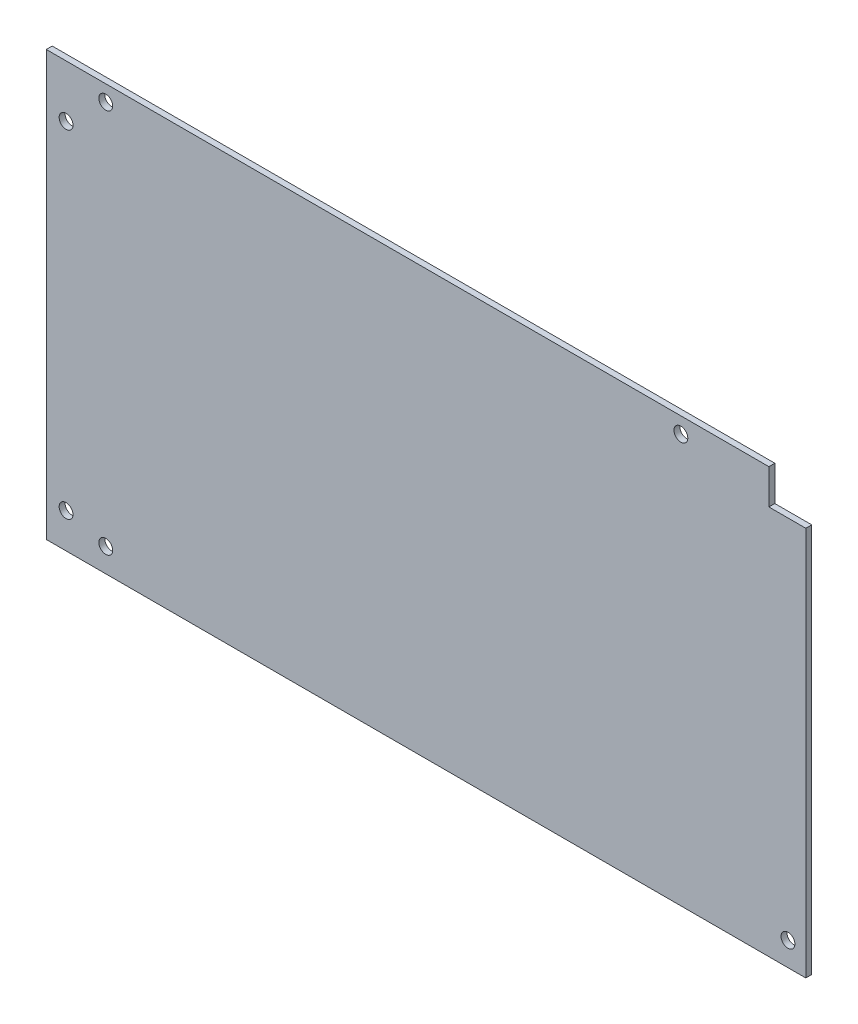
ISO-10303-21;
HEADER;
FILE_DESCRIPTION(('STEP AP214'),'2;1');
FILE_NAME('part.step','',(''),(''),'','','');
FILE_SCHEMA(('AUTOMOTIVE_DESIGN { 1 0 10303 214 1 1 1 1 }'));
ENDSEC;
DATA;
#1=APPLICATION_CONTEXT('core data for automotive mechanical design processes');
#2=APPLICATION_PROTOCOL_DEFINITION('international standard','automotive_design',2000,#1);
#3=PRODUCT_CONTEXT('',#1,'mechanical');
#4=PRODUCT('Part','Part','',(#3));
#5=PRODUCT_RELATED_PRODUCT_CATEGORY('part','',(#4));
#6=PRODUCT_DEFINITION_FORMATION('','',#4);
#7=PRODUCT_DEFINITION_CONTEXT('part definition',#1,'design');
#8=PRODUCT_DEFINITION('design','',#6,#7);
#9=PRODUCT_DEFINITION_SHAPE('','',#8);
#10=(LENGTH_UNIT() NAMED_UNIT(*) SI_UNIT(.MILLI.,.METRE.));
#11=(NAMED_UNIT(*) PLANE_ANGLE_UNIT() SI_UNIT($,.RADIAN.));
#12=(NAMED_UNIT(*) SI_UNIT($,.STERADIAN.) SOLID_ANGLE_UNIT());
#13=UNCERTAINTY_MEASURE_WITH_UNIT(LENGTH_MEASURE(1.E-05),#10,'distance_accuracy_value','');
#14=(GEOMETRIC_REPRESENTATION_CONTEXT(3) GLOBAL_UNCERTAINTY_ASSIGNED_CONTEXT((#13)) GLOBAL_UNIT_ASSIGNED_CONTEXT((#10,
#11,#12)) REPRESENTATION_CONTEXT('',''));
#15=CARTESIAN_POINT('',(0.,0.,0.));
#16=DIRECTION('',(0.,0.,1.));
#17=DIRECTION('',(1.,0.,0.));
#18=AXIS2_PLACEMENT_3D('',#15,#16,#17);
#19=CARTESIAN_POINT('',(-0.137085427136,-0.137085427136,1.5));
#20=DIRECTION('',(0.,0.,-1.));
#21=DIRECTION('',(-1.,0.,0.));
#22=AXIS2_PLACEMENT_3D('',#19,#20,#21);
#23=PLANE('',#22);
#24=CARTESIAN_POINT('',(91.25,-47.5,1.5));
#25=DIRECTION('',(0.,0.,-1.));
#26=DIRECTION('',(-1.,0.,0.));
#27=AXIS2_PLACEMENT_3D('',#24,#25,#26);
#28=CIRCLE('',#27,1.75);
#29=CARTESIAN_POINT('',(89.5,-47.5,1.5));
#30=VERTEX_POINT('',#29);
#31=EDGE_CURVE('E110',#30,#30,#28,.T.);
#32=ORIENTED_EDGE('',*,*,#31,.T.);
#33=EDGE_LOOP('',(#32));
#34=FACE_BOUND('',#33,.T.);
#35=CARTESIAN_POINT('',(-80.75,-47.5,1.5));
#36=DIRECTION('',(0.,0.,-1.));
#37=DIRECTION('',(-1.,0.,0.));
#38=AXIS2_PLACEMENT_3D('',#35,#36,#37);
#39=CIRCLE('',#38,1.75);
#40=CARTESIAN_POINT('',(-82.5,-47.5,1.5));
#41=VERTEX_POINT('',#40);
#42=EDGE_CURVE('E114',#41,#41,#39,.T.);
#43=ORIENTED_EDGE('',*,*,#42,.T.);
#44=EDGE_LOOP('',(#43));
#45=FACE_BOUND('',#44,.T.);
#46=CARTESIAN_POINT('',(-90.75,-44.7,1.5));
#47=DIRECTION('',(0.,0.,-1.));
#48=DIRECTION('',(-1.,0.,0.));
#49=AXIS2_PLACEMENT_3D('',#46,#47,#48);
#50=CIRCLE('',#49,1.75);
#51=CARTESIAN_POINT('',(-92.5,-44.7,1.5));
#52=VERTEX_POINT('',#51);
#53=EDGE_CURVE('E117',#52,#52,#50,.T.);
#54=ORIENTED_EDGE('',*,*,#53,.T.);
#55=EDGE_LOOP('',(#54));
#56=FACE_BOUND('',#55,.T.);
#57=CARTESIAN_POINT('',(-90.75,40.3,1.5));
#58=DIRECTION('',(0.,0.,-1.));
#59=DIRECTION('',(-1.,0.,0.));
#60=AXIS2_PLACEMENT_3D('',#57,#58,#59);
#61=CIRCLE('',#60,1.75);
#62=CARTESIAN_POINT('',(-92.5,40.3,1.5));
#63=VERTEX_POINT('',#62);
#64=EDGE_CURVE('E120',#63,#63,#61,.T.);
#65=ORIENTED_EDGE('',*,*,#64,.T.);
#66=EDGE_LOOP('',(#65));
#67=FACE_BOUND('',#66,.T.);
#68=CARTESIAN_POINT('',(-80.75,49.5,1.5));
#69=DIRECTION('',(0.,0.,-1.));
#70=DIRECTION('',(-1.,0.,0.));
#71=AXIS2_PLACEMENT_3D('',#68,#69,#70);
#72=CIRCLE('',#71,1.75);
#73=CARTESIAN_POINT('',(-82.5,49.5,1.5));
#74=VERTEX_POINT('',#73);
#75=EDGE_CURVE('E122',#74,#74,#72,.T.);
#76=ORIENTED_EDGE('',*,*,#75,.T.);
#77=EDGE_LOOP('',(#76));
#78=FACE_BOUND('',#77,.T.);
#79=CARTESIAN_POINT('',(64.25,49.5,1.5));
#80=DIRECTION('',(0.,0.,-1.));
#81=DIRECTION('',(-1.,0.,0.));
#82=AXIS2_PLACEMENT_3D('',#79,#80,#81);
#83=CIRCLE('',#82,1.75);
#84=CARTESIAN_POINT('',(62.5,49.5,1.5));
#85=VERTEX_POINT('',#84);
#86=EDGE_CURVE('E20',#85,#85,#83,.T.);
#87=ORIENTED_EDGE('',*,*,#86,.T.);
#88=EDGE_LOOP('',(#87));
#89=FACE_BOUND('',#88,.T.);
#90=DIRECTION('',(1.,0.,0.));
#91=VECTOR('',#90,1.);
#92=CARTESIAN_POINT('',(95.75,-53.5,1.5));
#93=LINE('',#92,#91);
#94=CARTESIAN_POINT('',(95.75,-53.5,1.5));
#95=VERTEX_POINT('',#94);
#96=CARTESIAN_POINT('',(-95.75,-53.5,1.5));
#97=VERTEX_POINT('',#96);
#98=EDGE_CURVE('E138',#95,#97,#93,.F.);
#99=ORIENTED_EDGE('',*,*,#98,.F.);
#100=DIRECTION('',(0.,1.,0.));
#101=VECTOR('',#100,1.);
#102=CARTESIAN_POINT('',(95.75,44.7,1.5));
#103=LINE('',#102,#101);
#104=CARTESIAN_POINT('',(95.75,44.7,1.5));
#105=VERTEX_POINT('',#104);
#106=EDGE_CURVE('E143',#105,#95,#103,.F.);
#107=ORIENTED_EDGE('',*,*,#106,.F.);
#108=DIRECTION('',(1.,0.,0.));
#109=VECTOR('',#108,1.);
#110=CARTESIAN_POINT('',(86.45,44.7,1.5));
#111=LINE('',#110,#109);
#112=CARTESIAN_POINT('',(86.45,44.7,1.5));
#113=VERTEX_POINT('',#112);
#114=EDGE_CURVE('E84',#113,#105,#111,.T.);
#115=ORIENTED_EDGE('',*,*,#114,.F.);
#116=DIRECTION('',(0.,1.,0.));
#117=VECTOR('',#116,1.);
#118=CARTESIAN_POINT('',(86.45,53.5,1.5));
#119=LINE('',#118,#117);
#120=CARTESIAN_POINT('',(86.45,53.5,1.5));
#121=VERTEX_POINT('',#120);
#122=EDGE_CURVE('E67',#121,#113,#119,.F.);
#123=ORIENTED_EDGE('',*,*,#122,.F.);
#124=DIRECTION('',(1.,0.,0.));
#125=VECTOR('',#124,1.);
#126=CARTESIAN_POINT('',(-95.75,53.5,1.5));
#127=LINE('',#126,#125);
#128=CARTESIAN_POINT('',(-95.75,53.5,1.5));
#129=VERTEX_POINT('',#128);
#130=EDGE_CURVE('E72',#129,#121,#127,.T.);
#131=ORIENTED_EDGE('',*,*,#130,.F.);
#132=DIRECTION('',(0.,1.,0.));
#133=VECTOR('',#132,1.);
#134=CARTESIAN_POINT('',(-95.75,-53.5,1.5));
#135=LINE('',#134,#133);
#136=EDGE_CURVE('E129',#97,#129,#135,.T.);
#137=ORIENTED_EDGE('',*,*,#136,.F.);
#138=EDGE_LOOP('',(#99,#107,#115,#123,#131,#137));
#139=FACE_BOUND('',#138,.T.);
#140=ADVANCED_FACE('F17',(#34,#45,#56,#67,#78,#89,#139),#23,.F.);
#141=CARTESIAN_POINT('',(-95.75,53.5,0.));
#142=DIRECTION('',(0.,1.,0.));
#143=DIRECTION('',(0.,0.,1.));
#144=AXIS2_PLACEMENT_3D('',#141,#142,#143);
#145=PLANE('',#144);
#146=DIRECTION('',(0.,0.,-1.));
#147=VECTOR('',#146,1.);
#148=CARTESIAN_POINT('',(86.45,53.5,0.));
#149=LINE('',#148,#147);
#150=CARTESIAN_POINT('',(86.45,53.5,0.));
#151=VERTEX_POINT('',#150);
#152=EDGE_CURVE('E74',#151,#121,#149,.F.);
#153=ORIENTED_EDGE('',*,*,#152,.F.);
#154=DIRECTION('',(-1.,0.,0.));
#155=VECTOR('',#154,1.);
#156=CARTESIAN_POINT('',(-0.137085427136,53.5,0.));
#157=LINE('',#156,#155);
#158=CARTESIAN_POINT('',(-95.75,53.5,0.));
#159=VERTEX_POINT('',#158);
#160=EDGE_CURVE('E113',#159,#151,#157,.F.);
#161=ORIENTED_EDGE('',*,*,#160,.F.);
#162=DIRECTION('',(0.,0.,1.));
#163=VECTOR('',#162,1.);
#164=CARTESIAN_POINT('',(-95.75,53.5,0.));
#165=LINE('',#164,#163);
#166=EDGE_CURVE('E77',#129,#159,#165,.F.);
#167=ORIENTED_EDGE('',*,*,#166,.F.);
#168=ORIENTED_EDGE('',*,*,#130,.T.);
#169=EDGE_LOOP('',(#153,#161,#167,#168));
#170=FACE_BOUND('',#169,.T.);
#171=ADVANCED_FACE('F73',(#170),#145,.T.);
#172=CARTESIAN_POINT('',(86.45,53.5,0.));
#173=DIRECTION('',(1.,0.,0.));
#174=DIRECTION('',(0.,0.,-1.));
#175=AXIS2_PLACEMENT_3D('',#172,#173,#174);
#176=PLANE('',#175);
#177=DIRECTION('',(0.,0.,1.));
#178=VECTOR('',#177,1.);
#179=CARTESIAN_POINT('',(86.45,44.7,0.));
#180=LINE('',#179,#178);
#181=CARTESIAN_POINT('',(86.45,44.7,0.));
#182=VERTEX_POINT('',#181);
#183=EDGE_CURVE('E86',#182,#113,#180,.T.);
#184=ORIENTED_EDGE('',*,*,#183,.F.);
#185=DIRECTION('',(0.,1.,0.));
#186=VECTOR('',#185,1.);
#187=CARTESIAN_POINT('',(86.45,-0.137085427136,0.));
#188=LINE('',#187,#186);
#189=EDGE_CURVE('E90',#151,#182,#188,.F.);
#190=ORIENTED_EDGE('',*,*,#189,.F.);
#191=ORIENTED_EDGE('',*,*,#152,.T.);
#192=ORIENTED_EDGE('',*,*,#122,.T.);
#193=EDGE_LOOP('',(#184,#190,#191,#192));
#194=FACE_BOUND('',#193,.T.);
#195=ADVANCED_FACE('F88',(#194),#176,.T.);
#196=CARTESIAN_POINT('',(86.45,44.7,0.));
#197=DIRECTION('',(0.,1.,0.));
#198=DIRECTION('',(0.,0.,1.));
#199=AXIS2_PLACEMENT_3D('',#196,#197,#198);
#200=PLANE('',#199);
#201=DIRECTION('',(0.,0.,-1.));
#202=VECTOR('',#201,1.);
#203=CARTESIAN_POINT('',(95.75,44.7,0.));
#204=LINE('',#203,#202);
#205=CARTESIAN_POINT('',(95.75,44.7,0.));
#206=VERTEX_POINT('',#205);
#207=EDGE_CURVE('E145',#206,#105,#204,.F.);
#208=ORIENTED_EDGE('',*,*,#207,.F.);
#209=DIRECTION('',(-1.,0.,0.));
#210=VECTOR('',#209,1.);
#211=CARTESIAN_POINT('',(-0.137085427136,44.7,0.));
#212=LINE('',#211,#210);
#213=EDGE_CURVE('E152',#182,#206,#212,.F.);
#214=ORIENTED_EDGE('',*,*,#213,.F.);
#215=ORIENTED_EDGE('',*,*,#183,.T.);
#216=ORIENTED_EDGE('',*,*,#114,.T.);
#217=EDGE_LOOP('',(#208,#214,#215,#216));
#218=FACE_BOUND('',#217,.T.);
#219=ADVANCED_FACE('F150',(#218),#200,.T.);
#220=CARTESIAN_POINT('',(95.75,44.7,0.));
#221=DIRECTION('',(1.,0.,0.));
#222=DIRECTION('',(0.,0.,-1.));
#223=AXIS2_PLACEMENT_3D('',#220,#221,#222);
#224=PLANE('',#223);
#225=DIRECTION('',(0.,0.,-1.));
#226=VECTOR('',#225,1.);
#227=CARTESIAN_POINT('',(95.75,-53.5,0.));
#228=LINE('',#227,#226);
#229=CARTESIAN_POINT('',(95.75,-53.5,0.));
#230=VERTEX_POINT('',#229);
#231=EDGE_CURVE('E140',#230,#95,#228,.F.);
#232=ORIENTED_EDGE('',*,*,#231,.F.);
#233=DIRECTION('',(0.,1.,0.));
#234=VECTOR('',#233,1.);
#235=CARTESIAN_POINT('',(95.75,-0.137085427136,0.));
#236=LINE('',#235,#234);
#237=EDGE_CURVE('E156',#206,#230,#236,.F.);
#238=ORIENTED_EDGE('',*,*,#237,.F.);
#239=ORIENTED_EDGE('',*,*,#207,.T.);
#240=ORIENTED_EDGE('',*,*,#106,.T.);
#241=EDGE_LOOP('',(#232,#238,#239,#240));
#242=FACE_BOUND('',#241,.T.);
#243=ADVANCED_FACE('F167',(#242),#224,.T.);
#244=CARTESIAN_POINT('',(95.75,-53.5,0.));
#245=DIRECTION('',(0.,-1.,0.));
#246=DIRECTION('',(0.,0.,-1.));
#247=AXIS2_PLACEMENT_3D('',#244,#245,#246);
#248=PLANE('',#247);
#249=DIRECTION('',(0.,0.,1.));
#250=VECTOR('',#249,1.);
#251=CARTESIAN_POINT('',(-95.75,-53.5,0.));
#252=LINE('',#251,#250);
#253=CARTESIAN_POINT('',(-95.75,-53.5,0.));
#254=VERTEX_POINT('',#253);
#255=EDGE_CURVE('E35',#254,#97,#252,.T.);
#256=ORIENTED_EDGE('',*,*,#255,.F.);
#257=DIRECTION('',(-1.,0.,0.));
#258=VECTOR('',#257,1.);
#259=CARTESIAN_POINT('',(-0.137085427136,-53.5,0.));
#260=LINE('',#259,#258);
#261=EDGE_CURVE('E162',#230,#254,#260,.T.);
#262=ORIENTED_EDGE('',*,*,#261,.F.);
#263=ORIENTED_EDGE('',*,*,#231,.T.);
#264=ORIENTED_EDGE('',*,*,#98,.T.);
#265=EDGE_LOOP('',(#256,#262,#263,#264));
#266=FACE_BOUND('',#265,.T.);
#267=ADVANCED_FACE('F165',(#266),#248,.T.);
#268=CARTESIAN_POINT('',(-95.75,-53.5,0.));
#269=DIRECTION('',(-1.,0.,0.));
#270=DIRECTION('',(0.,0.,1.));
#271=AXIS2_PLACEMENT_3D('',#268,#269,#270);
#272=PLANE('',#271);
#273=ORIENTED_EDGE('',*,*,#166,.T.);
#274=DIRECTION('',(0.,1.,0.));
#275=VECTOR('',#274,1.);
#276=CARTESIAN_POINT('',(-95.75,-0.137085427136,0.));
#277=LINE('',#276,#275);
#278=EDGE_CURVE('E109',#254,#159,#277,.T.);
#279=ORIENTED_EDGE('',*,*,#278,.F.);
#280=ORIENTED_EDGE('',*,*,#255,.T.);
#281=ORIENTED_EDGE('',*,*,#136,.T.);
#282=EDGE_LOOP('',(#273,#279,#280,#281));
#283=FACE_BOUND('',#282,.T.);
#284=ADVANCED_FACE('F164',(#283),#272,.T.);
#285=CARTESIAN_POINT('',(64.25,49.5,0.));
#286=DIRECTION('',(0.,0.,-1.));
#287=DIRECTION('',(-1.,0.,0.));
#288=AXIS2_PLACEMENT_3D('',#285,#286,#287);
#289=CYLINDRICAL_SURFACE('',#288,1.75);
#290=ORIENTED_EDGE('',*,*,#86,.F.);
#291=EDGE_LOOP('',(#290));
#292=FACE_BOUND('',#291,.T.);
#293=CARTESIAN_POINT('',(64.25,49.5,0.));
#294=DIRECTION('',(0.,0.,-1.));
#295=DIRECTION('',(-1.,0.,0.));
#296=AXIS2_PLACEMENT_3D('',#293,#294,#295);
#297=CIRCLE('',#296,1.75);
#298=CARTESIAN_POINT('',(62.5,49.5,0.));
#299=VERTEX_POINT('',#298);
#300=EDGE_CURVE('E106',#299,#299,#297,.F.);
#301=ORIENTED_EDGE('',*,*,#300,.F.);
#302=EDGE_LOOP('',(#301));
#303=FACE_BOUND('',#302,.T.);
#304=ADVANCED_FACE('F203',(#292,#303),#289,.F.);
#305=CARTESIAN_POINT('',(-80.75,49.5,0.));
#306=DIRECTION('',(0.,0.,-1.));
#307=DIRECTION('',(-1.,0.,0.));
#308=AXIS2_PLACEMENT_3D('',#305,#306,#307);
#309=CYLINDRICAL_SURFACE('',#308,1.75);
#310=ORIENTED_EDGE('',*,*,#75,.F.);
#311=EDGE_LOOP('',(#310));
#312=FACE_BOUND('',#311,.T.);
#313=CARTESIAN_POINT('',(-80.75,49.5,0.));
#314=DIRECTION('',(0.,0.,-1.));
#315=DIRECTION('',(-1.,0.,0.));
#316=AXIS2_PLACEMENT_3D('',#313,#314,#315);
#317=CIRCLE('',#316,1.75);
#318=CARTESIAN_POINT('',(-82.5,49.5,0.));
#319=VERTEX_POINT('',#318);
#320=EDGE_CURVE('E103',#319,#319,#317,.F.);
#321=ORIENTED_EDGE('',*,*,#320,.F.);
#322=EDGE_LOOP('',(#321));
#323=FACE_BOUND('',#322,.T.);
#324=ADVANCED_FACE('F199',(#312,#323),#309,.F.);
#325=CARTESIAN_POINT('',(-90.75,40.3,0.));
#326=DIRECTION('',(0.,0.,-1.));
#327=DIRECTION('',(-1.,0.,0.));
#328=AXIS2_PLACEMENT_3D('',#325,#326,#327);
#329=CYLINDRICAL_SURFACE('',#328,1.75);
#330=ORIENTED_EDGE('',*,*,#64,.F.);
#331=EDGE_LOOP('',(#330));
#332=FACE_BOUND('',#331,.T.);
#333=CARTESIAN_POINT('',(-90.75,40.3,0.));
#334=DIRECTION('',(0.,0.,-1.));
#335=DIRECTION('',(-1.,0.,0.));
#336=AXIS2_PLACEMENT_3D('',#333,#334,#335);
#337=CIRCLE('',#336,1.75);
#338=CARTESIAN_POINT('',(-92.5,40.3,0.));
#339=VERTEX_POINT('',#338);
#340=EDGE_CURVE('E100',#339,#339,#337,.F.);
#341=ORIENTED_EDGE('',*,*,#340,.F.);
#342=EDGE_LOOP('',(#341));
#343=FACE_BOUND('',#342,.T.);
#344=ADVANCED_FACE('F195',(#332,#343),#329,.F.);
#345=CARTESIAN_POINT('',(-90.75,-44.7,0.));
#346=DIRECTION('',(0.,0.,-1.));
#347=DIRECTION('',(-1.,0.,0.));
#348=AXIS2_PLACEMENT_3D('',#345,#346,#347);
#349=CYLINDRICAL_SURFACE('',#348,1.75);
#350=ORIENTED_EDGE('',*,*,#53,.F.);
#351=EDGE_LOOP('',(#350));
#352=FACE_BOUND('',#351,.T.);
#353=CARTESIAN_POINT('',(-90.75,-44.7,0.));
#354=DIRECTION('',(0.,0.,-1.));
#355=DIRECTION('',(-1.,0.,0.));
#356=AXIS2_PLACEMENT_3D('',#353,#354,#355);
#357=CIRCLE('',#356,1.75);
#358=CARTESIAN_POINT('',(-92.5,-44.7,0.));
#359=VERTEX_POINT('',#358);
#360=EDGE_CURVE('E97',#359,#359,#357,.F.);
#361=ORIENTED_EDGE('',*,*,#360,.F.);
#362=EDGE_LOOP('',(#361));
#363=FACE_BOUND('',#362,.T.);
#364=ADVANCED_FACE('F191',(#352,#363),#349,.F.);
#365=CARTESIAN_POINT('',(-80.75,-47.5,0.));
#366=DIRECTION('',(0.,0.,-1.));
#367=DIRECTION('',(-1.,0.,0.));
#368=AXIS2_PLACEMENT_3D('',#365,#366,#367);
#369=CYLINDRICAL_SURFACE('',#368,1.75);
#370=ORIENTED_EDGE('',*,*,#42,.F.);
#371=EDGE_LOOP('',(#370));
#372=FACE_BOUND('',#371,.T.);
#373=CARTESIAN_POINT('',(-80.75,-47.5,0.));
#374=DIRECTION('',(0.,0.,-1.));
#375=DIRECTION('',(-1.,0.,0.));
#376=AXIS2_PLACEMENT_3D('',#373,#374,#375);
#377=CIRCLE('',#376,1.75);
#378=CARTESIAN_POINT('',(-82.5,-47.5,0.));
#379=VERTEX_POINT('',#378);
#380=EDGE_CURVE('E26',#379,#379,#377,.F.);
#381=ORIENTED_EDGE('',*,*,#380,.F.);
#382=EDGE_LOOP('',(#381));
#383=FACE_BOUND('',#382,.T.);
#384=ADVANCED_FACE('F184',(#372,#383),#369,.F.);
#385=CARTESIAN_POINT('',(91.25,-47.5,0.));
#386=DIRECTION('',(0.,0.,-1.));
#387=DIRECTION('',(-1.,0.,0.));
#388=AXIS2_PLACEMENT_3D('',#385,#386,#387);
#389=CYLINDRICAL_SURFACE('',#388,1.75);
#390=ORIENTED_EDGE('',*,*,#31,.F.);
#391=EDGE_LOOP('',(#390));
#392=FACE_BOUND('',#391,.T.);
#393=CARTESIAN_POINT('',(91.25,-47.5,0.));
#394=DIRECTION('',(0.,0.,-1.));
#395=DIRECTION('',(-1.,0.,0.));
#396=AXIS2_PLACEMENT_3D('',#393,#394,#395);
#397=CIRCLE('',#396,1.75);
#398=CARTESIAN_POINT('',(89.5,-47.5,0.));
#399=VERTEX_POINT('',#398);
#400=EDGE_CURVE('E11',#399,#399,#397,.F.);
#401=ORIENTED_EDGE('',*,*,#400,.F.);
#402=EDGE_LOOP('',(#401));
#403=FACE_BOUND('',#402,.T.);
#404=ADVANCED_FACE('F178',(#392,#403),#389,.F.);
#405=CARTESIAN_POINT('',(-0.137085427136,-0.137085427136,0.));
#406=DIRECTION('',(0.,0.,-1.));
#407=DIRECTION('',(-1.,0.,0.));
#408=AXIS2_PLACEMENT_3D('',#405,#406,#407);
#409=PLANE('',#408);
#410=ORIENTED_EDGE('',*,*,#400,.T.);
#411=EDGE_LOOP('',(#410));
#412=FACE_BOUND('',#411,.T.);
#413=ORIENTED_EDGE('',*,*,#380,.T.);
#414=EDGE_LOOP('',(#413));
#415=FACE_BOUND('',#414,.T.);
#416=ORIENTED_EDGE('',*,*,#360,.T.);
#417=EDGE_LOOP('',(#416));
#418=FACE_BOUND('',#417,.T.);
#419=ORIENTED_EDGE('',*,*,#340,.T.);
#420=EDGE_LOOP('',(#419));
#421=FACE_BOUND('',#420,.T.);
#422=ORIENTED_EDGE('',*,*,#320,.T.);
#423=EDGE_LOOP('',(#422));
#424=FACE_BOUND('',#423,.T.);
#425=ORIENTED_EDGE('',*,*,#300,.T.);
#426=EDGE_LOOP('',(#425));
#427=FACE_BOUND('',#426,.T.);
#428=ORIENTED_EDGE('',*,*,#261,.T.);
#429=ORIENTED_EDGE('',*,*,#278,.T.);
#430=ORIENTED_EDGE('',*,*,#160,.T.);
#431=ORIENTED_EDGE('',*,*,#189,.T.);
#432=ORIENTED_EDGE('',*,*,#213,.T.);
#433=ORIENTED_EDGE('',*,*,#237,.T.);
#434=EDGE_LOOP('',(#428,#429,#430,#431,#432,#433));
#435=FACE_BOUND('',#434,.T.);
#436=ADVANCED_FACE('F159',(#412,#415,#418,#421,#424,#427,#435),#409,.T.);
#437=CLOSED_SHELL('',(#140,#171,#195,#219,#243,#267,#284,#304,#324,#344,#364,#384,#404,#436));
#438=MANIFOLD_SOLID_BREP('B1',#437);
#439=ADVANCED_BREP_SHAPE_REPRESENTATION('',(#18,#438),#14);
#440=SHAPE_DEFINITION_REPRESENTATION(#9,#439);
ENDSEC;
END-ISO-10303-21;
